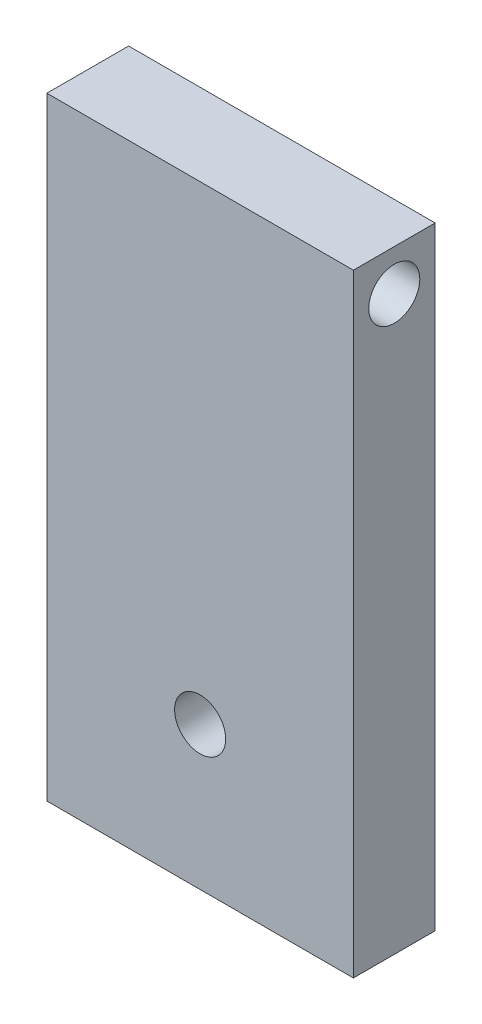
ISO-10303-21;
HEADER;
FILE_DESCRIPTION(('STEP AP214'),'2;1');
FILE_NAME('part.step','',(''),(''),'','','');
FILE_SCHEMA(('AUTOMOTIVE_DESIGN { 1 0 10303 214 1 1 1 1 }'));
ENDSEC;
DATA;
#1=APPLICATION_CONTEXT('core data for automotive mechanical design processes');
#2=APPLICATION_PROTOCOL_DEFINITION('international standard','automotive_design',2000,#1);
#3=PRODUCT_CONTEXT('',#1,'mechanical');
#4=PRODUCT('Part','Part','',(#3));
#5=PRODUCT_RELATED_PRODUCT_CATEGORY('part','',(#4));
#6=PRODUCT_DEFINITION_FORMATION('','',#4);
#7=PRODUCT_DEFINITION_CONTEXT('part definition',#1,'design');
#8=PRODUCT_DEFINITION('design','',#6,#7);
#9=PRODUCT_DEFINITION_SHAPE('','',#8);
#10=(LENGTH_UNIT() NAMED_UNIT(*) SI_UNIT(.MILLI.,.METRE.));
#11=(NAMED_UNIT(*) PLANE_ANGLE_UNIT() SI_UNIT($,.RADIAN.));
#12=(NAMED_UNIT(*) SI_UNIT($,.STERADIAN.) SOLID_ANGLE_UNIT());
#13=UNCERTAINTY_MEASURE_WITH_UNIT(LENGTH_MEASURE(1.E-05),#10,'distance_accuracy_value','');
#14=(GEOMETRIC_REPRESENTATION_CONTEXT(3) GLOBAL_UNCERTAINTY_ASSIGNED_CONTEXT((#13)) GLOBAL_UNIT_ASSIGNED_CONTEXT((#10,
#11,#12)) REPRESENTATION_CONTEXT('',''));
#15=CARTESIAN_POINT('',(0.,0.,0.));
#16=DIRECTION('',(0.,0.,1.));
#17=DIRECTION('',(1.,0.,0.));
#18=AXIS2_PLACEMENT_3D('',#15,#16,#17);
#19=CARTESIAN_POINT('',(15.,30.,-8.));
#20=DIRECTION('',(1.,0.,0.));
#21=DIRECTION('',(0.,1.,0.));
#22=AXIS2_PLACEMENT_3D('',#19,#20,#21);
#23=PLANE('',#22);
#24=CARTESIAN_POINT('',(15.,26.,-4.));
#25=DIRECTION('',(1.,0.,0.));
#26=DIRECTION('',(0.,1.,0.));
#27=AXIS2_PLACEMENT_3D('',#24,#25,#26);
#28=CIRCLE('',#27,2.5);
#29=CARTESIAN_POINT('',(15.,28.5,-4.));
#30=VERTEX_POINT('',#29);
#31=EDGE_CURVE('E178',#30,#30,#28,.T.);
#32=ORIENTED_EDGE('',*,*,#31,.F.);
#33=EDGE_LOOP('',(#32));
#34=FACE_BOUND('',#33,.T.);
#35=DIRECTION('',(0.,1.,0.));
#36=VECTOR('',#35,1.);
#37=CARTESIAN_POINT('',(15.,30.,0.));
#38=LINE('',#37,#36);
#39=CARTESIAN_POINT('',(15.,-30.,0.));
#40=VERTEX_POINT('',#39);
#41=CARTESIAN_POINT('',(15.,30.,0.));
#42=VERTEX_POINT('',#41);
#43=EDGE_CURVE('E97',#40,#42,#38,.T.);
#44=ORIENTED_EDGE('',*,*,#43,.F.);
#45=DIRECTION('',(0.,0.,1.));
#46=VECTOR('',#45,1.);
#47=CARTESIAN_POINT('',(15.,-30.,-8.));
#48=LINE('',#47,#46);
#49=CARTESIAN_POINT('',(15.,-30.,-8.));
#50=VERTEX_POINT('',#49);
#51=EDGE_CURVE('E11',#50,#40,#48,.T.);
#52=ORIENTED_EDGE('',*,*,#51,.F.);
#53=DIRECTION('',(0.,1.,0.));
#54=VECTOR('',#53,1.);
#55=CARTESIAN_POINT('',(15.,30.,-8.));
#56=LINE('',#55,#54);
#57=CARTESIAN_POINT('',(15.,30.,-8.));
#58=VERTEX_POINT('',#57);
#59=EDGE_CURVE('E90',#50,#58,#56,.T.);
#60=ORIENTED_EDGE('',*,*,#59,.T.);
#61=DIRECTION('',(0.,0.,1.));
#62=VECTOR('',#61,1.);
#63=CARTESIAN_POINT('',(15.,30.,-8.));
#64=LINE('',#63,#62);
#65=EDGE_CURVE('E35',#58,#42,#64,.T.);
#66=ORIENTED_EDGE('',*,*,#65,.T.);
#67=EDGE_LOOP('',(#44,#52,#60,#66));
#68=FACE_BOUND('',#67,.T.);
#69=ADVANCED_FACE('F32',(#34,#68),#23,.T.);
#70=CARTESIAN_POINT('',(-15.,-30.,-8.));
#71=DIRECTION('',(0.,-1.,0.));
#72=DIRECTION('',(0.,0.,-1.));
#73=AXIS2_PLACEMENT_3D('',#70,#71,#72);
#74=PLANE('',#73);
#75=CARTESIAN_POINT('',(10.,-30.,-4.));
#76=DIRECTION('',(0.,-1.,0.));
#77=DIRECTION('',(0.,0.,-1.));
#78=AXIS2_PLACEMENT_3D('',#75,#76,#77);
#79=CIRCLE('',#78,2.);
#80=CARTESIAN_POINT('',(10.,-30.,-6.));
#81=VERTEX_POINT('',#80);
#82=EDGE_CURVE('E166',#81,#81,#79,.T.);
#83=ORIENTED_EDGE('',*,*,#82,.F.);
#84=EDGE_LOOP('',(#83));
#85=FACE_BOUND('',#84,.T.);
#86=CARTESIAN_POINT('',(-10.,-30.,-4.));
#87=DIRECTION('',(0.,-1.,0.));
#88=DIRECTION('',(0.,0.,-1.));
#89=AXIS2_PLACEMENT_3D('',#86,#87,#88);
#90=CIRCLE('',#89,2.);
#91=CARTESIAN_POINT('',(-10.,-30.,-6.));
#92=VERTEX_POINT('',#91);
#93=EDGE_CURVE('E172',#92,#92,#90,.T.);
#94=ORIENTED_EDGE('',*,*,#93,.F.);
#95=EDGE_LOOP('',(#94));
#96=FACE_BOUND('',#95,.T.);
#97=DIRECTION('',(1.,0.,0.));
#98=VECTOR('',#97,1.);
#99=CARTESIAN_POINT('',(-15.,-30.,0.));
#100=LINE('',#99,#98);
#101=CARTESIAN_POINT('',(-15.,-30.,0.));
#102=VERTEX_POINT('',#101);
#103=EDGE_CURVE('E92',#102,#40,#100,.T.);
#104=ORIENTED_EDGE('',*,*,#103,.F.);
#105=DIRECTION('',(0.,0.,1.));
#106=VECTOR('',#105,1.);
#107=CARTESIAN_POINT('',(-15.,-30.,-8.));
#108=LINE('',#107,#106);
#109=CARTESIAN_POINT('',(-15.,-30.,-8.));
#110=VERTEX_POINT('',#109);
#111=EDGE_CURVE('E41',#110,#102,#108,.T.);
#112=ORIENTED_EDGE('',*,*,#111,.F.);
#113=DIRECTION('',(1.,0.,0.));
#114=VECTOR('',#113,1.);
#115=CARTESIAN_POINT('',(-15.,-30.,-8.));
#116=LINE('',#115,#114);
#117=EDGE_CURVE('E87',#110,#50,#116,.T.);
#118=ORIENTED_EDGE('',*,*,#117,.T.);
#119=ORIENTED_EDGE('',*,*,#51,.T.);
#120=EDGE_LOOP('',(#104,#112,#118,#119));
#121=FACE_BOUND('',#120,.T.);
#122=ADVANCED_FACE('F108',(#85,#96,#121),#74,.T.);
#123=CARTESIAN_POINT('',(-15.,30.,-8.));
#124=DIRECTION('',(-1.,0.,0.));
#125=DIRECTION('',(0.,-1.,0.));
#126=AXIS2_PLACEMENT_3D('',#123,#124,#125);
#127=PLANE('',#126);
#128=CARTESIAN_POINT('',(-15.,26.,-4.));
#129=DIRECTION('',(1.,0.,0.));
#130=DIRECTION('',(0.,1.,0.));
#131=AXIS2_PLACEMENT_3D('',#128,#129,#130);
#132=CIRCLE('',#131,2.5);
#133=CARTESIAN_POINT('',(-15.,28.5,-4.));
#134=VERTEX_POINT('',#133);
#135=EDGE_CURVE('E101',#134,#134,#132,.T.);
#136=ORIENTED_EDGE('',*,*,#135,.T.);
#137=EDGE_LOOP('',(#136));
#138=FACE_BOUND('',#137,.T.);
#139=DIRECTION('',(0.,-1.,0.));
#140=VECTOR('',#139,1.);
#141=CARTESIAN_POINT('',(-15.,30.,0.));
#142=LINE('',#141,#140);
#143=CARTESIAN_POINT('',(-15.,30.,0.));
#144=VERTEX_POINT('',#143);
#145=EDGE_CURVE('E82',#144,#102,#142,.T.);
#146=ORIENTED_EDGE('',*,*,#145,.F.);
#147=DIRECTION('',(0.,0.,1.));
#148=VECTOR('',#147,1.);
#149=CARTESIAN_POINT('',(-15.,30.,-8.));
#150=LINE('',#149,#148);
#151=CARTESIAN_POINT('',(-15.,30.,-8.));
#152=VERTEX_POINT('',#151);
#153=EDGE_CURVE('E77',#152,#144,#150,.T.);
#154=ORIENTED_EDGE('',*,*,#153,.F.);
#155=DIRECTION('',(0.,-1.,0.));
#156=VECTOR('',#155,1.);
#157=CARTESIAN_POINT('',(-15.,30.,-8.));
#158=LINE('',#157,#156);
#159=EDGE_CURVE('E80',#152,#110,#158,.T.);
#160=ORIENTED_EDGE('',*,*,#159,.T.);
#161=ORIENTED_EDGE('',*,*,#111,.T.);
#162=EDGE_LOOP('',(#146,#154,#160,#161));
#163=FACE_BOUND('',#162,.T.);
#164=ADVANCED_FACE('F79',(#138,#163),#127,.T.);
#165=CARTESIAN_POINT('',(-15.,30.,-8.));
#166=DIRECTION('',(0.,1.,0.));
#167=DIRECTION('',(0.,0.,1.));
#168=AXIS2_PLACEMENT_3D('',#165,#166,#167);
#169=PLANE('',#168);
#170=DIRECTION('',(-1.,0.,0.));
#171=VECTOR('',#170,1.);
#172=CARTESIAN_POINT('',(-15.,30.,0.));
#173=LINE('',#172,#171);
#174=EDGE_CURVE('E100',#42,#144,#173,.T.);
#175=ORIENTED_EDGE('',*,*,#174,.F.);
#176=ORIENTED_EDGE('',*,*,#65,.F.);
#177=DIRECTION('',(-1.,0.,0.));
#178=VECTOR('',#177,1.);
#179=CARTESIAN_POINT('',(-15.,30.,-8.));
#180=LINE('',#179,#178);
#181=EDGE_CURVE('E86',#58,#152,#180,.T.);
#182=ORIENTED_EDGE('',*,*,#181,.T.);
#183=ORIENTED_EDGE('',*,*,#153,.T.);
#184=EDGE_LOOP('',(#175,#176,#182,#183));
#185=FACE_BOUND('',#184,.T.);
#186=ADVANCED_FACE('F89',(#185),#169,.T.);
#187=CARTESIAN_POINT('',(0.,0.,-8.));
#188=DIRECTION('',(0.,0.,1.));
#189=DIRECTION('',(1.,0.,0.));
#190=AXIS2_PLACEMENT_3D('',#187,#188,#189);
#191=PLANE('',#190);
#192=CARTESIAN_POINT('',(0.,-16.,-8.));
#193=DIRECTION('',(0.,0.,1.));
#194=DIRECTION('',(1.,0.,0.));
#195=AXIS2_PLACEMENT_3D('',#192,#193,#194);
#196=CIRCLE('',#195,2.5);
#197=CARTESIAN_POINT('',(2.49999999999999,-16.,-8.));
#198=VERTEX_POINT('',#197);
#199=EDGE_CURVE('E161',#198,#198,#196,.T.);
#200=ORIENTED_EDGE('',*,*,#199,.T.);
#201=EDGE_LOOP('',(#200));
#202=FACE_BOUND('',#201,.T.);
#203=ORIENTED_EDGE('',*,*,#59,.F.);
#204=ORIENTED_EDGE('',*,*,#117,.F.);
#205=ORIENTED_EDGE('',*,*,#159,.F.);
#206=ORIENTED_EDGE('',*,*,#181,.F.);
#207=EDGE_LOOP('',(#203,#204,#205,#206));
#208=FACE_BOUND('',#207,.T.);
#209=ADVANCED_FACE('F85',(#202,#208),#191,.F.);
#210=CARTESIAN_POINT('',(0.,0.,0.));
#211=DIRECTION('',(0.,0.,1.));
#212=DIRECTION('',(1.,0.,0.));
#213=AXIS2_PLACEMENT_3D('',#210,#211,#212);
#214=PLANE('',#213);
#215=CARTESIAN_POINT('',(0.,-16.,0.));
#216=DIRECTION('',(0.,0.,1.));
#217=DIRECTION('',(1.,0.,0.));
#218=AXIS2_PLACEMENT_3D('',#215,#216,#217);
#219=CIRCLE('',#218,2.5);
#220=CARTESIAN_POINT('',(2.49999999999999,-16.,0.));
#221=VERTEX_POINT('',#220);
#222=EDGE_CURVE('E164',#221,#221,#219,.T.);
#223=ORIENTED_EDGE('',*,*,#222,.F.);
#224=EDGE_LOOP('',(#223));
#225=FACE_BOUND('',#224,.T.);
#226=ORIENTED_EDGE('',*,*,#43,.T.);
#227=ORIENTED_EDGE('',*,*,#174,.T.);
#228=ORIENTED_EDGE('',*,*,#145,.T.);
#229=ORIENTED_EDGE('',*,*,#103,.T.);
#230=EDGE_LOOP('',(#226,#227,#228,#229));
#231=FACE_BOUND('',#230,.T.);
#232=ADVANCED_FACE('F107',(#225,#231),#214,.T.);
#233=CARTESIAN_POINT('',(-15.,26.,-4.));
#234=DIRECTION('',(1.,0.,0.));
#235=DIRECTION('',(0.,1.,0.));
#236=AXIS2_PLACEMENT_3D('',#233,#234,#235);
#237=CYLINDRICAL_SURFACE('',#236,2.5);
#238=ORIENTED_EDGE('',*,*,#135,.F.);
#239=EDGE_LOOP('',(#238));
#240=FACE_BOUND('',#239,.T.);
#241=ORIENTED_EDGE('',*,*,#31,.T.);
#242=EDGE_LOOP('',(#241));
#243=FACE_BOUND('',#242,.T.);
#244=ADVANCED_FACE('F131',(#240,#243),#237,.F.);
#245=CARTESIAN_POINT('',(-10.,-15.,-4.));
#246=DIRECTION('',(0.,-1.,0.));
#247=DIRECTION('',(0.,0.,-1.));
#248=AXIS2_PLACEMENT_3D('',#245,#246,#247);
#249=CYLINDRICAL_SURFACE('',#248,2.);
#250=CARTESIAN_POINT('',(-10.,-15.,-4.));
#251=DIRECTION('',(0.,-1.,0.));
#252=DIRECTION('',(0.,0.,-1.));
#253=AXIS2_PLACEMENT_3D('',#250,#251,#252);
#254=CIRCLE('',#253,2.);
#255=CARTESIAN_POINT('',(-10.,-15.,-6.));
#256=VERTEX_POINT('',#255);
#257=EDGE_CURVE('E175',#256,#256,#254,.T.);
#258=ORIENTED_EDGE('',*,*,#257,.F.);
#259=EDGE_LOOP('',(#258));
#260=FACE_BOUND('',#259,.T.);
#261=ORIENTED_EDGE('',*,*,#93,.T.);
#262=EDGE_LOOP('',(#261));
#263=FACE_BOUND('',#262,.T.);
#264=ADVANCED_FACE('F137',(#260,#263),#249,.F.);
#265=CARTESIAN_POINT('',(-10.,-15.,-4.));
#266=DIRECTION('',(0.,-1.,0.));
#267=DIRECTION('',(0.,0.,-1.));
#268=AXIS2_PLACEMENT_3D('',#265,#266,#267);
#269=PLANE('',#268);
#270=ORIENTED_EDGE('',*,*,#257,.T.);
#271=EDGE_LOOP('',(#270));
#272=FACE_BOUND('',#271,.T.);
#273=ADVANCED_FACE('F141',(#272),#269,.T.);
#274=CARTESIAN_POINT('',(10.,-15.,-4.));
#275=DIRECTION('',(0.,-1.,0.));
#276=DIRECTION('',(0.,0.,-1.));
#277=AXIS2_PLACEMENT_3D('',#274,#275,#276);
#278=CYLINDRICAL_SURFACE('',#277,2.);
#279=CARTESIAN_POINT('',(10.,-15.,-4.));
#280=DIRECTION('',(0.,-1.,0.));
#281=DIRECTION('',(0.,0.,-1.));
#282=AXIS2_PLACEMENT_3D('',#279,#280,#281);
#283=CIRCLE('',#282,2.);
#284=CARTESIAN_POINT('',(10.,-15.,-6.));
#285=VERTEX_POINT('',#284);
#286=EDGE_CURVE('E169',#285,#285,#283,.T.);
#287=ORIENTED_EDGE('',*,*,#286,.F.);
#288=EDGE_LOOP('',(#287));
#289=FACE_BOUND('',#288,.T.);
#290=ORIENTED_EDGE('',*,*,#82,.T.);
#291=EDGE_LOOP('',(#290));
#292=FACE_BOUND('',#291,.T.);
#293=ADVANCED_FACE('F145',(#289,#292),#278,.F.);
#294=CARTESIAN_POINT('',(10.,-15.,-4.));
#295=DIRECTION('',(0.,-1.,0.));
#296=DIRECTION('',(0.,0.,-1.));
#297=AXIS2_PLACEMENT_3D('',#294,#295,#296);
#298=PLANE('',#297);
#299=ORIENTED_EDGE('',*,*,#286,.T.);
#300=EDGE_LOOP('',(#299));
#301=FACE_BOUND('',#300,.T.);
#302=ADVANCED_FACE('F149',(#301),#298,.T.);
#303=CARTESIAN_POINT('',(0.,-16.,-8.));
#304=DIRECTION('',(0.,0.,1.));
#305=DIRECTION('',(1.,0.,0.));
#306=AXIS2_PLACEMENT_3D('',#303,#304,#305);
#307=CYLINDRICAL_SURFACE('',#306,2.5);
#308=ORIENTED_EDGE('',*,*,#199,.F.);
#309=EDGE_LOOP('',(#308));
#310=FACE_BOUND('',#309,.T.);
#311=ORIENTED_EDGE('',*,*,#222,.T.);
#312=EDGE_LOOP('',(#311));
#313=FACE_BOUND('',#312,.T.);
#314=ADVANCED_FACE('F153',(#310,#313),#307,.F.);
#315=CLOSED_SHELL('',(#69,#122,#164,#186,#209,#232,#244,#264,#273,#293,#302,#314));
#316=MANIFOLD_SOLID_BREP('B2',#315);
#317=ADVANCED_BREP_SHAPE_REPRESENTATION('',(#18,#316),#14);
#318=SHAPE_DEFINITION_REPRESENTATION(#9,#317);
ENDSEC;
END-ISO-10303-21;
